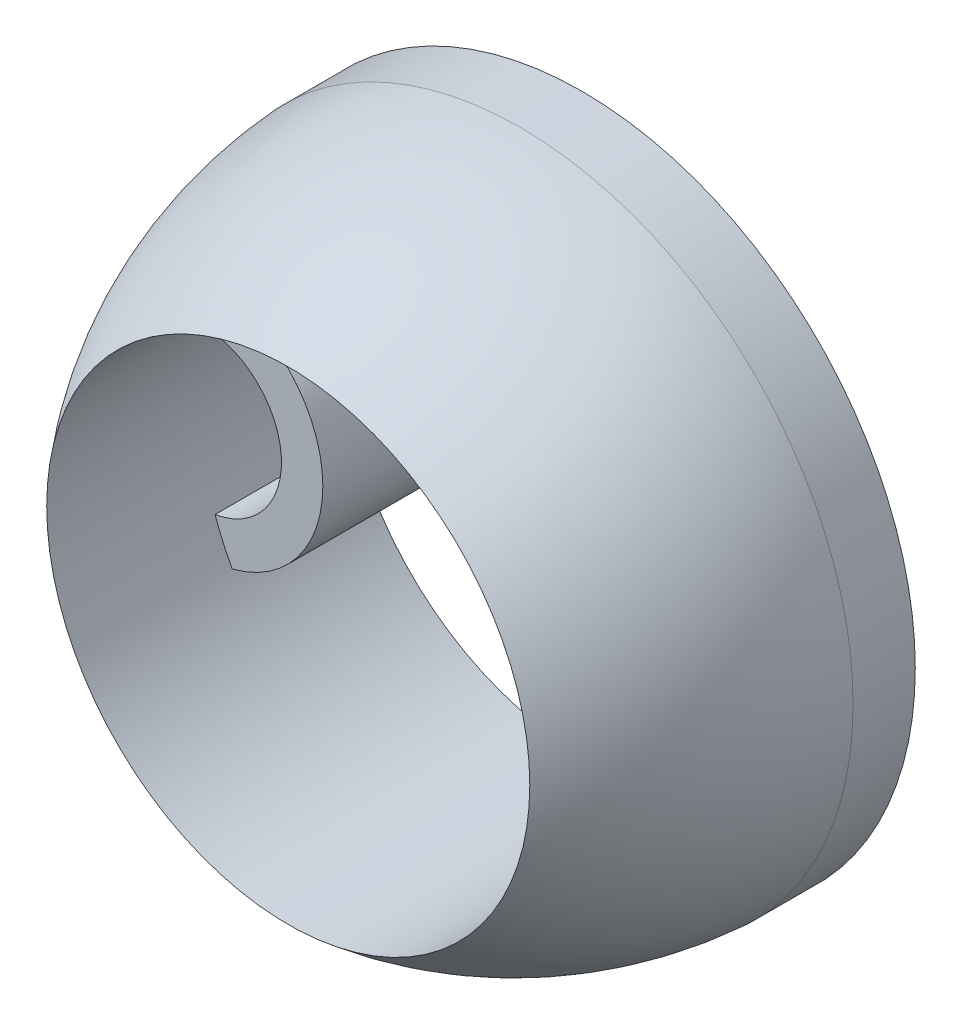
ISO-10303-21;
HEADER;
FILE_DESCRIPTION(('STEP AP214'),'2;1');
FILE_NAME('part.step','',(''),(''),'','','');
FILE_SCHEMA(('AUTOMOTIVE_DESIGN { 1 0 10303 214 1 1 1 1 }'));
ENDSEC;
DATA;
#1=APPLICATION_CONTEXT('core data for automotive mechanical design processes');
#2=APPLICATION_PROTOCOL_DEFINITION('international standard','automotive_design',2000,#1);
#3=PRODUCT_CONTEXT('',#1,'mechanical');
#4=PRODUCT('Part','Part','',(#3));
#5=PRODUCT_RELATED_PRODUCT_CATEGORY('part','',(#4));
#6=PRODUCT_DEFINITION_FORMATION('','',#4);
#7=PRODUCT_DEFINITION_CONTEXT('part definition',#1,'design');
#8=PRODUCT_DEFINITION('design','',#6,#7);
#9=PRODUCT_DEFINITION_SHAPE('','',#8);
#10=(LENGTH_UNIT() NAMED_UNIT(*) SI_UNIT(.MILLI.,.METRE.));
#11=(NAMED_UNIT(*) PLANE_ANGLE_UNIT() SI_UNIT($,.RADIAN.));
#12=(NAMED_UNIT(*) SI_UNIT($,.STERADIAN.) SOLID_ANGLE_UNIT());
#13=UNCERTAINTY_MEASURE_WITH_UNIT(LENGTH_MEASURE(1.E-05),#10,'distance_accuracy_value','');
#14=(GEOMETRIC_REPRESENTATION_CONTEXT(3) GLOBAL_UNCERTAINTY_ASSIGNED_CONTEXT((#13)) GLOBAL_UNIT_ASSIGNED_CONTEXT((#10,
#11,#12)) REPRESENTATION_CONTEXT('',''));
#15=CARTESIAN_POINT('',(0.,0.,0.));
#16=DIRECTION('',(0.,0.,1.));
#17=DIRECTION('',(1.,0.,0.));
#18=AXIS2_PLACEMENT_3D('',#15,#16,#17);
#19=CARTESIAN_POINT('',(11.7054817724565,0.,-3.38957095795252));
#20=DIRECTION('',(0.,0.,-1.));
#21=DIRECTION('',(-1.,0.,0.));
#22=AXIS2_PLACEMENT_3D('',#19,#20,#21);
#23=PLANE('',#22);
#24=CARTESIAN_POINT('',(11.7054817724565,0.,-3.38957095795252));
#25=DIRECTION('',(0.,0.,-1.));
#26=DIRECTION('',(-1.,0.,0.));
#27=AXIS2_PLACEMENT_3D('',#24,#25,#26);
#28=CIRCLE('',#27,14.82725);
#29=CARTESIAN_POINT('',(-1.26782259411188,7.17918633097628,-3.38957095795252));
#30=VERTEX_POINT('',#29);
#31=CARTESIAN_POINT('',(-1.26782259411188,-7.17918633097628,-3.38957095795252));
#32=VERTEX_POINT('',#31);
#33=EDGE_CURVE('E88',#30,#32,#28,.T.);
#34=ORIENTED_EDGE('',*,*,#33,.F.);
#35=CARTESIAN_POINT('',(-3.12176822754346,0.,-3.38957095795252));
#36=DIRECTION('',(0.,0.,-1.));
#37=DIRECTION('',(-1.,0.,0.));
#38=AXIS2_PLACEMENT_3D('',#35,#36,#37);
#39=CIRCLE('',#38,7.41470368838814);
#40=EDGE_CURVE('E103',#30,#32,#39,.T.);
#41=ORIENTED_EDGE('',*,*,#40,.T.);
#42=EDGE_LOOP('',(#34,#41));
#43=FACE_BOUND('',#42,.T.);
#44=CARTESIAN_POINT('',(-3.12176822754346,0.,-3.38957095795252));
#45=DIRECTION('',(0.,0.,-1.));
#46=DIRECTION('',(-1.,0.,0.));
#47=AXIS2_PLACEMENT_3D('',#44,#45,#46);
#48=CIRCLE('',#47,4.87470368838814);
#49=CARTESIAN_POINT('',(-2.32044849362163,4.80839086739133,-3.38957095795252));
#50=VERTEX_POINT('',#49);
#51=CARTESIAN_POINT('',(-2.32044849362163,-4.80839086739133,-3.38957095795252));
#52=VERTEX_POINT('',#51);
#53=EDGE_CURVE('E85',#50,#52,#48,.T.);
#54=ORIENTED_EDGE('',*,*,#53,.F.);
#55=EDGE_CURVE('E82',#52,#50,#28,.T.);
#56=ORIENTED_EDGE('',*,*,#55,.F.);
#57=EDGE_LOOP('',(#54,#56));
#58=FACE_BOUND('',#57,.T.);
#59=CARTESIAN_POINT('',(11.7054817724565,0.,-3.38957095795252));
#60=DIRECTION('',(0.,0.,-1.));
#61=DIRECTION('',(-1.,0.,0.));
#62=AXIS2_PLACEMENT_3D('',#59,#60,#61);
#63=CIRCLE('',#62,20.447);
#64=CARTESIAN_POINT('',(-8.74151822754346,0.,-3.38957095795252));
#65=VERTEX_POINT('',#64);
#66=EDGE_CURVE('E119',#65,#65,#63,.T.);
#67=ORIENTED_EDGE('',*,*,#66,.T.);
#68=EDGE_LOOP('',(#67));
#69=FACE_BOUND('',#68,.T.);
#70=ADVANCED_FACE('F46',(#43,#58,#69),#23,.T.);
#71=CARTESIAN_POINT('',(11.7054817724565,0.,-3.38957095795252));
#72=DIRECTION('',(0.,0.,-1.));
#73=DIRECTION('',(-1.,0.,0.));
#74=AXIS2_PLACEMENT_3D('',#71,#72,#73);
#75=CYLINDRICAL_SURFACE('',#74,20.447);
#76=CARTESIAN_POINT('',(11.7054817724565,0.,0.427226446279236));
#77=DIRECTION('',(0.,0.,-1.));
#78=DIRECTION('',(-1.,0.,0.));
#79=AXIS2_PLACEMENT_3D('',#76,#77,#78);
#80=CIRCLE('',#79,20.447);
#81=CARTESIAN_POINT('',(-8.74151822754346,0.,0.427226446279239));
#82=VERTEX_POINT('',#81);
#83=EDGE_CURVE('E115',#82,#82,#80,.T.);
#84=ORIENTED_EDGE('',*,*,#83,.T.);
#85=EDGE_LOOP('',(#84));
#86=FACE_BOUND('',#85,.T.);
#87=ORIENTED_EDGE('',*,*,#66,.F.);
#88=EDGE_LOOP('',(#87));
#89=FACE_BOUND('',#88,.T.);
#90=ADVANCED_FACE('F145',(#86,#89),#75,.T.);
#91=CARTESIAN_POINT('',(11.7054817724565,0.,-1.12389633301009));
#92=DIRECTION('',(0.,0.,-1.));
#93=DIRECTION('',(-1.,0.,0.));
#94=AXIS2_PLACEMENT_3D('',#91,#92,#93);
#95=DEGENERATE_TOROIDAL_SURFACE('',#94,4.29805151952728,24.7936192715079,.F.);
#96=CARTESIAN_POINT('',(11.7054817724565,0.,14.654138980921));
#97=DIRECTION('',(0.,0.,-1.));
#98=DIRECTION('',(-1.,0.,0.));
#99=AXIS2_PLACEMENT_3D('',#96,#97,#98);
#100=CIRCLE('',#99,14.82725);
#101=CARTESIAN_POINT('',(-3.12176822754346,0.,14.654138980921));
#102=VERTEX_POINT('',#101);
#103=EDGE_CURVE('E120',#102,#102,#100,.F.);
#104=ORIENTED_EDGE('',*,*,#103,.F.);
#105=EDGE_LOOP('',(#104));
#106=FACE_BOUND('',#105,.T.);
#107=ORIENTED_EDGE('',*,*,#83,.F.);
#108=EDGE_LOOP('',(#107));
#109=FACE_BOUND('',#108,.T.);
#110=ADVANCED_FACE('F151',(#106,#109),#95,.F.);
#111=CARTESIAN_POINT('',(11.7054817724565,0.,23.2943409030391));
#112=DIRECTION('',(0.,0.,-1.));
#113=DIRECTION('',(-1.,0.,0.));
#114=AXIS2_PLACEMENT_3D('',#111,#112,#113);
#115=CYLINDRICAL_SURFACE('',#114,14.82725);
#116=ORIENTED_EDGE('',*,*,#33,.T.);
#117=DIRECTION('',(0.,0.,-1.));
#118=VECTOR('',#117,1.);
#119=CARTESIAN_POINT('',(-1.26782259411188,-7.17918633097628,0.864929042047479));
#120=LINE('',#119,#118);
#121=CARTESIAN_POINT('',(-1.26782259411188,-7.17918633097628,5.11942904204748));
#122=VERTEX_POINT('',#121);
#123=EDGE_CURVE('E11',#32,#122,#120,.F.);
#124=ORIENTED_EDGE('',*,*,#123,.T.);
#125=CARTESIAN_POINT('',(11.7054817724565,0.,5.11942904204748));
#126=DIRECTION('',(0.,0.,-1.));
#127=DIRECTION('',(-1.,0.,0.));
#128=AXIS2_PLACEMENT_3D('',#125,#126,#127);
#129=CIRCLE('',#128,14.82725);
#130=CARTESIAN_POINT('',(-2.32044849362162,-4.80839086739134,5.11942904204748));
#131=VERTEX_POINT('',#130);
#132=EDGE_CURVE('E54',#131,#122,#129,.F.);
#133=ORIENTED_EDGE('',*,*,#132,.F.);
#134=DIRECTION('',(0.,0.,-1.));
#135=VECTOR('',#134,1.);
#136=CARTESIAN_POINT('',(-2.32044849362163,-4.80839086739133,5.11942904204748));
#137=LINE('',#136,#135);
#138=EDGE_CURVE('E92',#131,#52,#137,.T.);
#139=ORIENTED_EDGE('',*,*,#138,.T.);
#140=ORIENTED_EDGE('',*,*,#55,.T.);
#141=DIRECTION('',(0.,0.,-1.));
#142=VECTOR('',#141,1.);
#143=CARTESIAN_POINT('',(-2.32044849362163,4.80839086739133,5.11942904204748));
#144=LINE('',#143,#142);
#145=CARTESIAN_POINT('',(-2.32044849362162,4.80839086739133,5.11942904204748));
#146=VERTEX_POINT('',#145);
#147=EDGE_CURVE('E89',#146,#50,#144,.T.);
#148=ORIENTED_EDGE('',*,*,#147,.F.);
#149=CARTESIAN_POINT('',(-1.26782259411188,7.17918633097628,5.11942904204748));
#150=VERTEX_POINT('',#149);
#151=EDGE_CURVE('E124',#150,#146,#129,.F.);
#152=ORIENTED_EDGE('',*,*,#151,.F.);
#153=DIRECTION('',(0.,0.,-1.));
#154=VECTOR('',#153,1.);
#155=CARTESIAN_POINT('',(-1.26782259411188,7.17918633097628,0.864929042047479));
#156=LINE('',#155,#154);
#157=EDGE_CURVE('E130',#150,#30,#156,.T.);
#158=ORIENTED_EDGE('',*,*,#157,.T.);
#159=EDGE_LOOP('',(#116,#124,#133,#139,#140,#148,#152,#158));
#160=FACE_BOUND('',#159,.T.);
#161=ORIENTED_EDGE('',*,*,#103,.T.);
#162=EDGE_LOOP('',(#161));
#163=FACE_BOUND('',#162,.T.);
#164=ADVANCED_FACE('F93',(#160,#163),#115,.F.);
#165=CARTESIAN_POINT('',(-3.12176822754346,0.,5.11942904204748));
#166=DIRECTION('',(0.,0.,-1.));
#167=DIRECTION('',(-1.,0.,0.));
#168=AXIS2_PLACEMENT_3D('',#165,#166,#167);
#169=CYLINDRICAL_SURFACE('',#168,7.41470368838814);
#170=ORIENTED_EDGE('',*,*,#157,.F.);
#171=CARTESIAN_POINT('',(-3.12176822754346,0.,5.11942904204748));
#172=DIRECTION('',(0.,0.,-1.));
#173=DIRECTION('',(-1.,0.,0.));
#174=AXIS2_PLACEMENT_3D('',#171,#172,#173);
#175=CIRCLE('',#174,7.41470368838814);
#176=EDGE_CURVE('E102',#150,#122,#175,.T.);
#177=ORIENTED_EDGE('',*,*,#176,.T.);
#178=ORIENTED_EDGE('',*,*,#123,.F.);
#179=ORIENTED_EDGE('',*,*,#40,.F.);
#180=EDGE_LOOP('',(#170,#177,#178,#179));
#181=FACE_BOUND('',#180,.T.);
#182=ADVANCED_FACE('F140',(#181),#169,.T.);
#183=CARTESIAN_POINT('',(-3.12176822754346,0.,5.11942904204748));
#184=DIRECTION('',(0.,0.,-1.));
#185=DIRECTION('',(-1.,0.,0.));
#186=AXIS2_PLACEMENT_3D('',#183,#184,#185);
#187=PLANE('',#186);
#188=CARTESIAN_POINT('',(-3.12176822754346,0.,5.11942904204748));
#189=DIRECTION('',(0.,0.,-1.));
#190=DIRECTION('',(-1.,0.,0.));
#191=AXIS2_PLACEMENT_3D('',#188,#189,#190);
#192=CIRCLE('',#191,4.87470368838814);
#193=EDGE_CURVE('E98',#146,#131,#192,.T.);
#194=ORIENTED_EDGE('',*,*,#193,.T.);
#195=ORIENTED_EDGE('',*,*,#132,.T.);
#196=ORIENTED_EDGE('',*,*,#176,.F.);
#197=ORIENTED_EDGE('',*,*,#151,.T.);
#198=EDGE_LOOP('',(#194,#195,#196,#197));
#199=FACE_BOUND('',#198,.T.);
#200=ADVANCED_FACE('F138',(#199),#187,.F.);
#201=CARTESIAN_POINT('',(-3.12176822754346,0.,5.11942904204748));
#202=DIRECTION('',(0.,0.,-1.));
#203=DIRECTION('',(-1.,0.,0.));
#204=AXIS2_PLACEMENT_3D('',#201,#202,#203);
#205=CYLINDRICAL_SURFACE('',#204,4.87470368838814);
#206=ORIENTED_EDGE('',*,*,#53,.T.);
#207=ORIENTED_EDGE('',*,*,#138,.F.);
#208=ORIENTED_EDGE('',*,*,#193,.F.);
#209=ORIENTED_EDGE('',*,*,#147,.T.);
#210=EDGE_LOOP('',(#206,#207,#208,#209));
#211=FACE_BOUND('',#210,.T.);
#212=ADVANCED_FACE('F100',(#211),#205,.F.);
#213=CLOSED_SHELL('',(#70,#90,#110,#164,#182,#200,#212));
#214=MANIFOLD_SOLID_BREP('B2',#213);
#215=ADVANCED_BREP_SHAPE_REPRESENTATION('',(#18,#214),#14);
#216=SHAPE_DEFINITION_REPRESENTATION(#9,#215);
ENDSEC;
END-ISO-10303-21;
